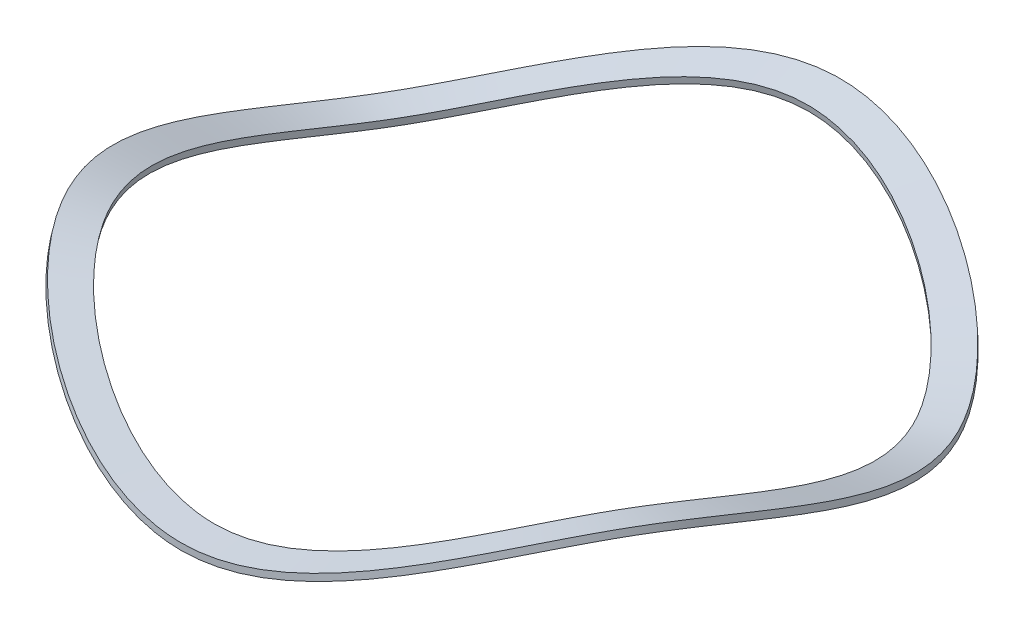
ISO-10303-21;
HEADER;
FILE_DESCRIPTION(('STEP AP214'),'2;1');
FILE_NAME('part.step','',(''),(''),'','','');
FILE_SCHEMA(('AUTOMOTIVE_DESIGN { 1 0 10303 214 1 1 1 1 }'));
ENDSEC;
DATA;
#1=APPLICATION_CONTEXT('core data for automotive mechanical design processes');
#2=APPLICATION_PROTOCOL_DEFINITION('international standard','automotive_design',2000,#1);
#3=PRODUCT_CONTEXT('',#1,'mechanical');
#4=PRODUCT('Part','Part','',(#3));
#5=PRODUCT_RELATED_PRODUCT_CATEGORY('part','',(#4));
#6=PRODUCT_DEFINITION_FORMATION('','',#4);
#7=PRODUCT_DEFINITION_CONTEXT('part definition',#1,'design');
#8=PRODUCT_DEFINITION('design','',#6,#7);
#9=PRODUCT_DEFINITION_SHAPE('','',#8);
#10=(LENGTH_UNIT() NAMED_UNIT(*) SI_UNIT(.MILLI.,.METRE.));
#11=(NAMED_UNIT(*) PLANE_ANGLE_UNIT() SI_UNIT($,.RADIAN.));
#12=(NAMED_UNIT(*) SI_UNIT($,.STERADIAN.) SOLID_ANGLE_UNIT());
#13=UNCERTAINTY_MEASURE_WITH_UNIT(LENGTH_MEASURE(1.E-05),#10,'distance_accuracy_value','');
#14=(GEOMETRIC_REPRESENTATION_CONTEXT(3) GLOBAL_UNCERTAINTY_ASSIGNED_CONTEXT((#13)) GLOBAL_UNIT_ASSIGNED_CONTEXT((#10,
#11,#12)) REPRESENTATION_CONTEXT('',''));
#15=CARTESIAN_POINT('',(0.,0.,0.));
#16=DIRECTION('',(0.,0.,1.));
#17=DIRECTION('',(1.,0.,0.));
#18=AXIS2_PLACEMENT_3D('',#15,#16,#17);
#19=CARTESIAN_POINT('',(0.,0.,50.));
#20=CARTESIAN_POINT('',(3.27154351431869,0.,50.));
#21=CARTESIAN_POINT('',(9.81463054295608,0.782702856647862,49.2882397162853));
#22=CARTESIAN_POINT('',(19.0975008115352,3.38770992085039,46.3508592418559));
#23=CARTESIAN_POINT('',(27.6704119648793,6.55080703150661,41.7493846863027));
#24=CARTESIAN_POINT('',(35.291598474836,9.45009416736736,35.6155367315555));
#25=CARTESIAN_POINT('',(40.2835668557036,10.8427070721693,29.6996978305193));
#26=CARTESIAN_POINT('',(43.8303700733728,11.1004022422383,24.0271337612607));
#27=CARTESIAN_POINT('',(46.7652272701126,10.5760329241454,17.9848707582708));
#28=CARTESIAN_POINT('',(49.1910504978211,8.56427069243838,9.55790119185278));
#29=CARTESIAN_POINT('',(50.0904045163231,5.48583683355643,-0.160659217913017));
#30=CARTESIAN_POINT('',(49.1907709544919,2.41804057128845,-9.84404482748729));
#31=CARTESIAN_POINT('',(46.7836107628812,0.432890377781105,-18.1803151037488));
#32=CARTESIAN_POINT('',(43.9111165307391,-0.0826369161392081,-24.0961567172201));
#33=CARTESIAN_POINT('',(40.4342546300705,0.172408592046726,-29.6532710739928));
#34=CARTESIAN_POINT('',(35.518996620466,1.54030422594464,-35.4872711204258));
#35=CARTESIAN_POINT('',(27.9442822467468,4.42209673444902,-41.5894228535622));
#36=CARTESIAN_POINT('',(19.3623990549779,7.58878977101956,-46.1996071362876));
#37=CARTESIAN_POINT('',(10.0085012142454,10.2179370467378,-49.1662614613891));
#38=CARTESIAN_POINT('',(0.,11.4177494644719,-50.259834078264));
#39=CARTESIAN_POINT('',(-10.0085012142454,10.2179370467378,-49.1662614613891));
#40=CARTESIAN_POINT('',(-19.3623990549779,7.58878977101956,-46.1996071362876));
#41=CARTESIAN_POINT('',(-27.9442822467468,4.42209673444902,-41.5894228535622));
#42=CARTESIAN_POINT('',(-35.518996620466,1.54030422594464,-35.4872711204258));
#43=CARTESIAN_POINT('',(-40.4342546300705,0.17240859204672,-29.6532710739928));
#44=CARTESIAN_POINT('',(-43.9111165307391,-0.082636916139211,-24.0961567172201));
#45=CARTESIAN_POINT('',(-46.7836107628812,0.432890377781105,-18.1803151037488));
#46=CARTESIAN_POINT('',(-49.1907709544919,2.41804057128844,-9.84404482748729));
#47=CARTESIAN_POINT('',(-50.0904045163231,5.48583683355641,-0.160659217913018));
#48=CARTESIAN_POINT('',(-49.1910504978212,8.56427069243839,9.5579011918528));
#49=CARTESIAN_POINT('',(-46.7652272701126,10.5760329241454,17.9848707582708));
#50=CARTESIAN_POINT('',(-43.8303700733728,11.1004022422383,24.0271337612607));
#51=CARTESIAN_POINT('',(-40.2835668557036,10.8427070721693,29.6996978305193));
#52=CARTESIAN_POINT('',(-35.291598474836,9.45009416736736,35.6155367315556));
#53=CARTESIAN_POINT('',(-27.6704119648793,6.55080703150661,41.7493846863027));
#54=CARTESIAN_POINT('',(-19.0975008115352,3.38770992085038,46.350859241856));
#55=CARTESIAN_POINT('',(-9.81463054295608,0.782702856647856,49.2882397162853));
#56=CARTESIAN_POINT('',(-3.2715435143187,0.,50.));
#57=CARTESIAN_POINT('',(0.,0.,50.));
#58=CARTESIAN_POINT('',(0.,0.,45.));
#59=CARTESIAN_POINT('',(2.92283573777247,0.,45.));
#60=CARTESIAN_POINT('',(8.76850721331743,0.703124999999999,44.3671875));
#61=CARTESIAN_POINT('',(17.2287465949167,3.076171875,41.697509765625));
#62=CARTESIAN_POINT('',(25.0724503130795,5.9765625,37.4853515625));
#63=CARTESIAN_POINT('',(31.9913505360861,8.61328124999935,31.9086914062514));
#64=CARTESIAN_POINT('',(36.4136618997475,9.84374999999966,26.6484375000017));
#65=CARTESIAN_POINT('',(39.5191748711311,10.0781250000002,21.6914062500019));
#66=CARTESIAN_POINT('',(42.076656141683,9.60937500000001,16.41796875));
#67=CARTESIAN_POINT('',(44.2687829450124,7.81250000000001,8.85937499999999));
#68=CARTESIAN_POINT('',(45.0908304962609,5.,0.));
#69=CARTESIAN_POINT('',(44.2687829450124,2.1875,-8.859375));
#70=CARTESIAN_POINT('',(42.076656141683,0.390625,-16.41796875));
#71=CARTESIAN_POINT('',(39.5191748711311,-0.0781250000001743,-21.691406250002));
#72=CARTESIAN_POINT('',(36.4136618997475,0.156250000000348,-26.6484375000017));
#73=CARTESIAN_POINT('',(31.9913505360862,1.38671875000065,-31.9086914062514));
#74=CARTESIAN_POINT('',(25.0724503130796,4.0234375,-37.4853515625));
#75=CARTESIAN_POINT('',(17.2287465949167,6.923828125,-41.697509765625));
#76=CARTESIAN_POINT('',(8.76850721331744,9.296875,-44.3671875));
#77=CARTESIAN_POINT('',(0.,10.3515625,-45.31640625));
#78=CARTESIAN_POINT('',(-8.76850721331743,9.296875,-44.3671875));
#79=CARTESIAN_POINT('',(-17.2287465949167,6.923828125,-41.697509765625));
#80=CARTESIAN_POINT('',(-25.0724503130795,4.0234375,-37.4853515625));
#81=CARTESIAN_POINT('',(-31.9913505360861,1.38671875000065,-31.9086914062514));
#82=CARTESIAN_POINT('',(-36.4136618997475,0.156250000000345,-26.6484375000017));
#83=CARTESIAN_POINT('',(-39.5191748711311,-0.0781250000001755,-21.691406250002));
#84=CARTESIAN_POINT('',(-42.076656141683,0.390625,-16.41796875));
#85=CARTESIAN_POINT('',(-44.2687829450124,2.1875,-8.85937500000002));
#86=CARTESIAN_POINT('',(-45.0908304962609,5.,0.));
#87=CARTESIAN_POINT('',(-44.2687829450124,7.81250000000001,8.859375));
#88=CARTESIAN_POINT('',(-42.076656141683,9.60937500000001,16.41796875));
#89=CARTESIAN_POINT('',(-39.5191748711311,10.0781250000002,21.691406250002));
#90=CARTESIAN_POINT('',(-36.4136618997475,9.84374999999966,26.6484375000018));
#91=CARTESIAN_POINT('',(-31.9913505360862,8.61328124999935,31.9086914062514));
#92=CARTESIAN_POINT('',(-25.0724503130796,5.9765625,37.4853515625));
#93=CARTESIAN_POINT('',(-17.2287465949167,3.076171875,41.697509765625));
#94=CARTESIAN_POINT('',(-8.76850721331744,0.703124999999999,44.3671875));
#95=CARTESIAN_POINT('',(-2.92283573777248,0.,45.));
#96=CARTESIAN_POINT('',(0.,0.,45.));
#97=B_SPLINE_SURFACE_WITH_KNOTS('',1,3,((#19,#20,#21,#22,#23,#24,#25,#26,#27,#28,#29,#30,#31,
#32,#33,#34,#35,#36,#37,#38,#39,#40,#41,#42,#43,#44,#45,#46,#47,#48,#49,#50,#51,#52,#53,#54,#55,
#56,#57),(#58,#59,#60,#61,#62,#63,#64,#65,#66,#67,#68,#69,#70,#71,#72,#73,#74,#75,#76,#77,#78,
#79,#80,#81,#82,#83,#84,#85,#86,#87,#88,#89,#90,#91,#92,#93,#94,#95,#96)),.UNSPECIFIED.,.F.,.T.,
.F.,(2,2),(4,1,1,1,1,1,1,1,1,1,1,1,1,1,1,1,1,1,1,1,1,1,1,1,1,1,1,1,1,1,1,1,1,1,1,1,4),
(0.583333333333333,1.),(0.,0.03125,0.0625,0.09375,0.125,0.156249999999977,0.166666666666667,
0.1875,0.21875,0.25,0.28125,0.3125,0.333333333333333,0.343750000000023,0.375,0.40625,0.4375,
0.46875,0.5,0.53125,0.5625,0.59375,0.625,0.656249999999977,0.666666666666667,0.6875,0.71875,
0.75,0.78125,0.8125,0.833333333333333,0.843750000000023,0.875,0.90625,0.9375,0.96875,1.),.UNSPECIFIED.);
#98=CARTESIAN_POINT('',(0.,0.,45.));
#99=CARTESIAN_POINT('',(2.92283573777247,0.,45.));
#100=CARTESIAN_POINT('',(8.76850721331743,0.703124999999999,44.3671875));
#101=CARTESIAN_POINT('',(17.2287465949167,3.076171875,41.697509765625));
#102=CARTESIAN_POINT('',(25.0724503130795,5.9765625,37.4853515625));
#103=CARTESIAN_POINT('',(31.9913505360861,8.61328124999935,31.9086914062514));
#104=CARTESIAN_POINT('',(36.4136618997475,9.84374999999966,26.6484375000017));
#105=CARTESIAN_POINT('',(39.5191748711311,10.0781250000002,21.6914062500019));
#106=CARTESIAN_POINT('',(42.076656141683,9.60937500000001,16.41796875));
#107=CARTESIAN_POINT('',(44.2687829450124,7.81250000000001,8.85937499999999));
#108=CARTESIAN_POINT('',(45.0908304962609,5.,0.));
#109=CARTESIAN_POINT('',(44.2687829450124,2.1875,-8.859375));
#110=CARTESIAN_POINT('',(42.076656141683,0.390625,-16.41796875));
#111=CARTESIAN_POINT('',(39.5191748711311,-0.0781250000001743,-21.691406250002));
#112=CARTESIAN_POINT('',(36.4136618997475,0.156250000000348,-26.6484375000017));
#113=CARTESIAN_POINT('',(31.9913505360862,1.38671875000065,-31.9086914062514));
#114=CARTESIAN_POINT('',(25.0724503130796,4.0234375,-37.4853515625));
#115=CARTESIAN_POINT('',(17.2287465949167,6.923828125,-41.697509765625));
#116=CARTESIAN_POINT('',(8.76850721331744,9.296875,-44.3671875));
#117=CARTESIAN_POINT('',(0.,10.3515625,-45.31640625));
#118=CARTESIAN_POINT('',(-8.76850721331743,9.296875,-44.3671875));
#119=CARTESIAN_POINT('',(-17.2287465949167,6.923828125,-41.697509765625));
#120=CARTESIAN_POINT('',(-25.0724503130795,4.0234375,-37.4853515625));
#121=CARTESIAN_POINT('',(-31.9913505360861,1.38671875000065,-31.9086914062514));
#122=CARTESIAN_POINT('',(-36.4136618997475,0.156250000000345,-26.6484375000017));
#123=CARTESIAN_POINT('',(-39.5191748711311,-0.0781250000001755,-21.691406250002));
#124=CARTESIAN_POINT('',(-42.076656141683,0.390625,-16.41796875));
#125=CARTESIAN_POINT('',(-44.2687829450124,2.1875,-8.85937500000002));
#126=CARTESIAN_POINT('',(-45.0908304962609,5.,0.));
#127=CARTESIAN_POINT('',(-44.2687829450124,7.81250000000001,8.859375));
#128=CARTESIAN_POINT('',(-42.076656141683,9.60937500000001,16.41796875));
#129=CARTESIAN_POINT('',(-39.5191748711311,10.0781250000002,21.691406250002));
#130=CARTESIAN_POINT('',(-36.4136618997475,9.84374999999966,26.6484375000018));
#131=CARTESIAN_POINT('',(-31.9913505360862,8.61328124999935,31.9086914062514));
#132=CARTESIAN_POINT('',(-25.0724503130796,5.9765625,37.4853515625));
#133=CARTESIAN_POINT('',(-17.2287465949167,3.076171875,41.697509765625));
#134=CARTESIAN_POINT('',(-8.76850721331744,0.703124999999999,44.3671875));
#135=CARTESIAN_POINT('',(-2.92283573777248,0.,45.));
#136=CARTESIAN_POINT('',(0.,0.,45.));
#137=B_SPLINE_CURVE_WITH_KNOTS('',3,(#98,#99,#100,#101,#102,#103,#104,#105,#106,#107,#108,#109,
#110,#111,#112,#113,#114,#115,#116,#117,#118,#119,#120,#121,#122,#123,#124,#125,#126,#127,#128,
#129,#130,#131,#132,#133,#134,#135,#136),.UNSPECIFIED.,.T.,.F.,(4,1,1,1,1,1,1,1,1,1,1,1,1,1,1,1,
1,1,1,1,1,1,1,1,1,1,1,1,1,1,1,1,1,1,1,1,4),(0.,0.03125,0.0625,0.09375,0.125,0.156249999999977,
0.166666666666667,0.1875,0.21875,0.25,0.28125,0.3125,0.333333333333333,0.343750000000023,0.375,
0.40625,0.4375,0.46875,0.5,0.53125,0.5625,0.59375,0.625,0.656249999999977,0.666666666666667,
0.6875,0.71875,0.75,0.78125,0.8125,0.833333333333333,0.843750000000023,0.875,0.90625,0.9375,
0.96875,1.),.UNSPECIFIED.);
#138=CARTESIAN_POINT('',(0.,0.,45.));
#139=VERTEX_POINT('',#138);
#140=EDGE_CURVE('E68',#139,#139,#137,.T.);
#141=CARTESIAN_POINT('',(0.,0.,50.));
#142=CARTESIAN_POINT('',(3.27154351431869,0.,50.));
#143=CARTESIAN_POINT('',(9.81463054295608,0.782702856647862,49.2882397162853));
#144=CARTESIAN_POINT('',(19.0975008115352,3.38770992085039,46.3508592418559));
#145=CARTESIAN_POINT('',(27.6704119648793,6.55080703150661,41.7493846863027));
#146=CARTESIAN_POINT('',(35.291598474836,9.45009416736736,35.6155367315555));
#147=CARTESIAN_POINT('',(40.2835668557036,10.8427070721693,29.6996978305193));
#148=CARTESIAN_POINT('',(43.8303700733728,11.1004022422383,24.0271337612607));
#149=CARTESIAN_POINT('',(46.7652272701126,10.5760329241454,17.9848707582708));
#150=CARTESIAN_POINT('',(49.1910504978211,8.56427069243838,9.55790119185278));
#151=CARTESIAN_POINT('',(50.0904045163231,5.48583683355643,-0.160659217913017));
#152=CARTESIAN_POINT('',(49.1907709544919,2.41804057128845,-9.84404482748729));
#153=CARTESIAN_POINT('',(46.7836107628812,0.432890377781105,-18.1803151037488));
#154=CARTESIAN_POINT('',(43.9111165307391,-0.0826369161392081,-24.0961567172201));
#155=CARTESIAN_POINT('',(40.4342546300705,0.172408592046726,-29.6532710739928));
#156=CARTESIAN_POINT('',(35.518996620466,1.54030422594464,-35.4872711204258));
#157=CARTESIAN_POINT('',(27.9442822467468,4.42209673444902,-41.5894228535622));
#158=CARTESIAN_POINT('',(19.3623990549779,7.58878977101956,-46.1996071362876));
#159=CARTESIAN_POINT('',(10.0085012142454,10.2179370467378,-49.1662614613891));
#160=CARTESIAN_POINT('',(0.,11.4177494644719,-50.259834078264));
#161=CARTESIAN_POINT('',(-10.0085012142454,10.2179370467378,-49.1662614613891));
#162=CARTESIAN_POINT('',(-19.3623990549779,7.58878977101956,-46.1996071362876));
#163=CARTESIAN_POINT('',(-27.9442822467468,4.42209673444902,-41.5894228535622));
#164=CARTESIAN_POINT('',(-35.518996620466,1.54030422594464,-35.4872711204258));
#165=CARTESIAN_POINT('',(-40.4342546300705,0.17240859204672,-29.6532710739928));
#166=CARTESIAN_POINT('',(-43.9111165307391,-0.082636916139211,-24.0961567172201));
#167=CARTESIAN_POINT('',(-46.7836107628812,0.432890377781105,-18.1803151037488));
#168=CARTESIAN_POINT('',(-49.1907709544919,2.41804057128844,-9.84404482748729));
#169=CARTESIAN_POINT('',(-50.0904045163231,5.48583683355641,-0.160659217913018));
#170=CARTESIAN_POINT('',(-49.1910504978212,8.56427069243839,9.5579011918528));
#171=CARTESIAN_POINT('',(-46.7652272701126,10.5760329241454,17.9848707582708));
#172=CARTESIAN_POINT('',(-43.8303700733728,11.1004022422383,24.0271337612607));
#173=CARTESIAN_POINT('',(-40.2835668557036,10.8427070721693,29.6996978305193));
#174=CARTESIAN_POINT('',(-35.291598474836,9.45009416736736,35.6155367315556));
#175=CARTESIAN_POINT('',(-27.6704119648793,6.55080703150661,41.7493846863027));
#176=CARTESIAN_POINT('',(-19.0975008115352,3.38770992085038,46.350859241856));
#177=CARTESIAN_POINT('',(-9.81463054295608,0.782702856647856,49.2882397162853));
#178=CARTESIAN_POINT('',(-3.2715435143187,0.,50.));
#179=CARTESIAN_POINT('',(0.,0.,50.));
#180=B_SPLINE_CURVE_WITH_KNOTS('',3,(#141,#142,#143,#144,#145,#146,#147,#148,#149,#150,#151,
#152,#153,#154,#155,#156,#157,#158,#159,#160,#161,#162,#163,#164,#165,#166,#167,#168,#169,#170,
#171,#172,#173,#174,#175,#176,#177,#178,#179),.UNSPECIFIED.,.T.,.F.,(4,1,1,1,1,1,1,1,1,1,1,1,1,
1,1,1,1,1,1,1,1,1,1,1,1,1,1,1,1,1,1,1,1,1,1,1,4),(0.,0.03125,0.0625,0.09375,0.125,
0.156249999999977,0.166666666666667,0.1875,0.21875,0.25,0.28125,0.3125,0.333333333333333,
0.343750000000023,0.375,0.40625,0.4375,0.46875,0.5,0.53125,0.5625,0.59375,0.625,
0.656249999999977,0.666666666666667,0.6875,0.71875,0.75,0.78125,0.8125,0.833333333333333,
0.843750000000023,0.875,0.90625,0.9375,0.96875,1.),.UNSPECIFIED.);
#181=CARTESIAN_POINT('',(0.,0.,50.));
#182=VERTEX_POINT('',#181);
#183=EDGE_CURVE('E64',#182,#182,#180,.T.);
#184=ORIENTED_EDGE('',*,*,#140,.T.);
#185=EDGE_LOOP('',(#184));
#186=FACE_BOUND('',#185,.T.);
#187=ORIENTED_EDGE('',*,*,#183,.F.);
#188=EDGE_LOOP('',(#187));
#189=FACE_BOUND('',#188,.T.);
#190=ADVANCED_FACE('F49',(#186,#189),#97,.T.);
#191=CARTESIAN_POINT('',(0.,0.999999999999999,50.));
#192=CARTESIAN_POINT('',(3.2008774090095,1.,50.));
#193=CARTESIAN_POINT('',(9.60263222702851,1.76419424027489,49.306849379359));
#194=CARTESIAN_POINT('',(18.7987950886189,4.3407117601444,46.4037375299214));
#195=CARTESIAN_POINT('',(27.3478902499427,7.49487158073612,41.8188291408217));
#196=CARTESIAN_POINT('',(35.0002884653279,10.4059457302109,35.6653019039945));
#197=CARTESIAN_POINT('',(40.0559060060034,11.819507781447,29.6825427860363));
#198=CARTESIAN_POINT('',(43.6623484999502,12.0793265102728,23.9112690642189));
#199=CARTESIAN_POINT('',(46.6507140639289,11.5474140844795,17.7606130550235));
#200=CARTESIAN_POINT('',(49.0900662090812,9.51392610769907,9.26239534477307));
#201=CARTESIAN_POINT('',(49.9875552582913,6.43051149918637,-0.473049474228799));
#202=CARTESIAN_POINT('',(49.0892431139196,3.37841852631132,-10.1049246322249));
#203=CARTESIAN_POINT('',(46.7048429318624,1.4232877757271,-18.3360848273275));
#204=CARTESIAN_POINT('',(43.900100617128,0.917410052083416,-24.1145021774537));
#205=CARTESIAN_POINT('',(40.4995952842342,1.16942704268995,-29.5458425515258));
#206=CARTESIAN_POINT('',(35.6698458964434,2.51021087330849,-35.2876330674673));
#207=CARTESIAN_POINT('',(28.1542815328534,5.36977335491723,-41.3478330669113));
#208=CARTESIAN_POINT('',(19.578768851796,8.53452111988729,-45.9583866191893));
#209=CARTESIAN_POINT('',(10.1734704292378,11.1821177506451,-48.947693209576));
#210=CARTESIAN_POINT('',(0.,12.40425207431,-50.0637746066024));
#211=CARTESIAN_POINT('',(-10.1734704292378,11.1821177506451,-48.947693209576));
#212=CARTESIAN_POINT('',(-19.578768851796,8.53452111988729,-45.9583866191893));
#213=CARTESIAN_POINT('',(-28.1542815328534,5.36977335491723,-41.3478330669113));
#214=CARTESIAN_POINT('',(-35.6698458964434,2.51021087330849,-35.2876330674673));
#215=CARTESIAN_POINT('',(-40.4995952842342,1.16942704268994,-29.5458425515258));
#216=CARTESIAN_POINT('',(-43.900100617128,0.917410052083413,-24.1145021774537));
#217=CARTESIAN_POINT('',(-46.7048429318624,1.4232877757271,-18.3360848273275));
#218=CARTESIAN_POINT('',(-49.0892431139196,3.37841852631131,-10.1049246322249));
#219=CARTESIAN_POINT('',(-49.9875552582913,6.43051149918636,-0.4730494742288));
#220=CARTESIAN_POINT('',(-49.0900662090812,9.51392610769907,9.26239534477309));
#221=CARTESIAN_POINT('',(-46.6507140639289,11.5474140844795,17.7606130550236));
#222=CARTESIAN_POINT('',(-43.6623484999502,12.0793265102728,23.9112690642189));
#223=CARTESIAN_POINT('',(-40.0559060060034,11.8195077814469,29.6825427860364));
#224=CARTESIAN_POINT('',(-35.0002884653279,10.4059457302109,35.6653019039946));
#225=CARTESIAN_POINT('',(-27.3478902499427,7.49487158073612,41.8188291408217));
#226=CARTESIAN_POINT('',(-18.7987950886189,4.34071176014439,46.4037375299215));
#227=CARTESIAN_POINT('',(-9.60263222702851,1.76419424027488,49.306849379359));
#228=CARTESIAN_POINT('',(-3.20087740900951,0.999999999999999,50.));
#229=CARTESIAN_POINT('',(0.,0.999999999999999,50.));
#230=CARTESIAN_POINT('',(0.,0.,50.));
#231=CARTESIAN_POINT('',(3.27154351431869,0.,50.));
#232=CARTESIAN_POINT('',(9.81463054295608,0.782702856647862,49.2882397162853));
#233=CARTESIAN_POINT('',(19.0975008115352,3.38770992085039,46.3508592418559));
#234=CARTESIAN_POINT('',(27.6704119648793,6.55080703150661,41.7493846863027));
#235=CARTESIAN_POINT('',(35.291598474836,9.45009416736736,35.6155367315555));
#236=CARTESIAN_POINT('',(40.2835668557036,10.8427070721693,29.6996978305193));
#237=CARTESIAN_POINT('',(43.8303700733728,11.1004022422383,24.0271337612607));
#238=CARTESIAN_POINT('',(46.7652272701126,10.5760329241454,17.9848707582708));
#239=CARTESIAN_POINT('',(49.1910504978211,8.56427069243838,9.55790119185278));
#240=CARTESIAN_POINT('',(50.0904045163231,5.48583683355643,-0.160659217913017));
#241=CARTESIAN_POINT('',(49.1907709544919,2.41804057128845,-9.84404482748729));
#242=CARTESIAN_POINT('',(46.7836107628812,0.432890377781105,-18.1803151037488));
#243=CARTESIAN_POINT('',(43.9111165307391,-0.0826369161392081,-24.0961567172201));
#244=CARTESIAN_POINT('',(40.4342546300705,0.172408592046726,-29.6532710739928));
#245=CARTESIAN_POINT('',(35.518996620466,1.54030422594464,-35.4872711204258));
#246=CARTESIAN_POINT('',(27.9442822467468,4.42209673444902,-41.5894228535622));
#247=CARTESIAN_POINT('',(19.3623990549779,7.58878977101956,-46.1996071362876));
#248=CARTESIAN_POINT('',(10.0085012142454,10.2179370467378,-49.1662614613891));
#249=CARTESIAN_POINT('',(0.,11.4177494644719,-50.259834078264));
#250=CARTESIAN_POINT('',(-10.0085012142454,10.2179370467378,-49.1662614613891));
#251=CARTESIAN_POINT('',(-19.3623990549779,7.58878977101956,-46.1996071362876));
#252=CARTESIAN_POINT('',(-27.9442822467468,4.42209673444902,-41.5894228535622));
#253=CARTESIAN_POINT('',(-35.518996620466,1.54030422594464,-35.4872711204258));
#254=CARTESIAN_POINT('',(-40.4342546300705,0.17240859204672,-29.6532710739928));
#255=CARTESIAN_POINT('',(-43.9111165307391,-0.082636916139211,-24.0961567172201));
#256=CARTESIAN_POINT('',(-46.7836107628812,0.432890377781105,-18.1803151037488));
#257=CARTESIAN_POINT('',(-49.1907709544919,2.41804057128844,-9.84404482748729));
#258=CARTESIAN_POINT('',(-50.0904045163231,5.48583683355641,-0.160659217913018));
#259=CARTESIAN_POINT('',(-49.1910504978212,8.56427069243839,9.5579011918528));
#260=CARTESIAN_POINT('',(-46.7652272701126,10.5760329241454,17.9848707582708));
#261=CARTESIAN_POINT('',(-43.8303700733728,11.1004022422383,24.0271337612607));
#262=CARTESIAN_POINT('',(-40.2835668557036,10.8427070721693,29.6996978305193));
#263=CARTESIAN_POINT('',(-35.291598474836,9.45009416736736,35.6155367315556));
#264=CARTESIAN_POINT('',(-27.6704119648793,6.55080703150661,41.7493846863027));
#265=CARTESIAN_POINT('',(-19.0975008115352,3.38770992085038,46.350859241856));
#266=CARTESIAN_POINT('',(-9.81463054295608,0.782702856647856,49.2882397162853));
#267=CARTESIAN_POINT('',(-3.2715435143187,0.,50.));
#268=CARTESIAN_POINT('',(0.,0.,50.));
#269=B_SPLINE_SURFACE_WITH_KNOTS('',1,3,((#191,#192,#193,#194,#195,#196,#197,#198,#199,#200,
#201,#202,#203,#204,#205,#206,#207,#208,#209,#210,#211,#212,#213,#214,#215,#216,#217,#218,#219,
#220,#221,#222,#223,#224,#225,#226,#227,#228,#229),(#230,#231,#232,#233,#234,#235,#236,#237,
#238,#239,#240,#241,#242,#243,#244,#245,#246,#247,#248,#249,#250,#251,#252,#253,#254,#255,#256,
#257,#258,#259,#260,#261,#262,#263,#264,#265,#266,#267,#268)),.UNSPECIFIED.,.F.,.T.,.F.,(2,2),
(4,1,1,1,1,1,1,1,1,1,1,1,1,1,1,1,1,1,1,1,1,1,1,1,1,1,1,1,1,1,1,1,1,1,1,1,4),(0.5,
0.583333333333333),(0.,0.03125,0.0625,0.09375,0.125,0.156249999999977,0.166666666666667,0.1875,
0.21875,0.25,0.28125,0.3125,0.333333333333333,0.343750000000023,0.375,0.40625,0.4375,0.46875,
0.5,0.53125,0.5625,0.59375,0.625,0.656249999999977,0.666666666666667,0.6875,0.71875,0.75,
0.78125,0.8125,0.833333333333333,0.843750000000023,0.875,0.90625,0.9375,0.96875,1.),.UNSPECIFIED.);
#270=CARTESIAN_POINT('',(0.,0.999999999999999,50.));
#271=CARTESIAN_POINT('',(3.2008774090095,1.,50.));
#272=CARTESIAN_POINT('',(9.60263222702851,1.76419424027489,49.306849379359));
#273=CARTESIAN_POINT('',(18.7987950886189,4.3407117601444,46.4037375299214));
#274=CARTESIAN_POINT('',(27.3478902499427,7.49487158073612,41.8188291408217));
#275=CARTESIAN_POINT('',(35.0002884653279,10.4059457302109,35.6653019039945));
#276=CARTESIAN_POINT('',(40.0559060060034,11.819507781447,29.6825427860363));
#277=CARTESIAN_POINT('',(43.6623484999502,12.0793265102728,23.9112690642189));
#278=CARTESIAN_POINT('',(46.6507140639289,11.5474140844795,17.7606130550235));
#279=CARTESIAN_POINT('',(49.0900662090812,9.51392610769907,9.26239534477307));
#280=CARTESIAN_POINT('',(49.9875552582913,6.43051149918637,-0.473049474228799));
#281=CARTESIAN_POINT('',(49.0892431139196,3.37841852631132,-10.1049246322249));
#282=CARTESIAN_POINT('',(46.7048429318624,1.4232877757271,-18.3360848273275));
#283=CARTESIAN_POINT('',(43.900100617128,0.917410052083416,-24.1145021774537));
#284=CARTESIAN_POINT('',(40.4995952842342,1.16942704268995,-29.5458425515258));
#285=CARTESIAN_POINT('',(35.6698458964434,2.51021087330849,-35.2876330674673));
#286=CARTESIAN_POINT('',(28.1542815328534,5.36977335491723,-41.3478330669113));
#287=CARTESIAN_POINT('',(19.578768851796,8.53452111988729,-45.9583866191893));
#288=CARTESIAN_POINT('',(10.1734704292378,11.1821177506451,-48.947693209576));
#289=CARTESIAN_POINT('',(0.,12.40425207431,-50.0637746066024));
#290=CARTESIAN_POINT('',(-10.1734704292378,11.1821177506451,-48.947693209576));
#291=CARTESIAN_POINT('',(-19.578768851796,8.53452111988729,-45.9583866191893));
#292=CARTESIAN_POINT('',(-28.1542815328534,5.36977335491723,-41.3478330669113));
#293=CARTESIAN_POINT('',(-35.6698458964434,2.51021087330849,-35.2876330674673));
#294=CARTESIAN_POINT('',(-40.4995952842342,1.16942704268994,-29.5458425515258));
#295=CARTESIAN_POINT('',(-43.900100617128,0.917410052083413,-24.1145021774537));
#296=CARTESIAN_POINT('',(-46.7048429318624,1.4232877757271,-18.3360848273275));
#297=CARTESIAN_POINT('',(-49.0892431139196,3.37841852631131,-10.1049246322249));
#298=CARTESIAN_POINT('',(-49.9875552582913,6.43051149918636,-0.4730494742288));
#299=CARTESIAN_POINT('',(-49.0900662090812,9.51392610769907,9.26239534477309));
#300=CARTESIAN_POINT('',(-46.6507140639289,11.5474140844795,17.7606130550236));
#301=CARTESIAN_POINT('',(-43.6623484999502,12.0793265102728,23.9112690642189));
#302=CARTESIAN_POINT('',(-40.0559060060034,11.8195077814469,29.6825427860364));
#303=CARTESIAN_POINT('',(-35.0002884653279,10.4059457302109,35.6653019039946));
#304=CARTESIAN_POINT('',(-27.3478902499427,7.49487158073612,41.8188291408217));
#305=CARTESIAN_POINT('',(-18.7987950886189,4.34071176014439,46.4037375299215));
#306=CARTESIAN_POINT('',(-9.60263222702851,1.76419424027488,49.306849379359));
#307=CARTESIAN_POINT('',(-3.20087740900951,0.999999999999999,50.));
#308=CARTESIAN_POINT('',(0.,0.999999999999999,50.));
#309=B_SPLINE_CURVE_WITH_KNOTS('',3,(#270,#271,#272,#273,#274,#275,#276,#277,#278,#279,#280,
#281,#282,#283,#284,#285,#286,#287,#288,#289,#290,#291,#292,#293,#294,#295,#296,#297,#298,#299,
#300,#301,#302,#303,#304,#305,#306,#307,#308),.UNSPECIFIED.,.T.,.F.,(4,1,1,1,1,1,1,1,1,1,1,1,1,
1,1,1,1,1,1,1,1,1,1,1,1,1,1,1,1,1,1,1,1,1,1,1,4),(0.,0.03125,0.0625,0.09375,0.125,
0.156249999999977,0.166666666666667,0.1875,0.21875,0.25,0.28125,0.3125,0.333333333333333,
0.343750000000023,0.375,0.40625,0.4375,0.46875,0.5,0.53125,0.5625,0.59375,0.625,
0.656249999999977,0.666666666666667,0.6875,0.71875,0.75,0.78125,0.8125,0.833333333333333,
0.843750000000023,0.875,0.90625,0.9375,0.96875,1.),.UNSPECIFIED.);
#310=CARTESIAN_POINT('',(0.,0.999999999999999,50.));
#311=VERTEX_POINT('',#310);
#312=EDGE_CURVE('E60',#311,#311,#309,.T.);
#313=ORIENTED_EDGE('',*,*,#183,.T.);
#314=EDGE_LOOP('',(#313));
#315=FACE_BOUND('',#314,.T.);
#316=ORIENTED_EDGE('',*,*,#312,.F.);
#317=EDGE_LOOP('',(#316));
#318=FACE_BOUND('',#317,.T.);
#319=ADVANCED_FACE('F96',(#315,#318),#269,.T.);
#320=CARTESIAN_POINT('',(0.,1.,45.));
#321=CARTESIAN_POINT('',(2.85216963246328,0.999999999999999,45.));
#322=CARTESIAN_POINT('',(8.55650889738986,1.68461638362702,44.3857971630737));
#323=CARTESIAN_POINT('',(16.9300408720004,4.02917371429401,41.7503880536905));
#324=CARTESIAN_POINT('',(24.749928598143,6.9206270492295,37.554796017019));
#325=CARTESIAN_POINT('',(31.7000405265781,9.56913281284291,31.9584565786904));
#326=CARTESIAN_POINT('',(36.1860010500472,10.8205507092773,26.6312824555188));
#327=CARTESIAN_POINT('',(39.3511532977085,11.0570492680347,21.5755415529602));
#328=CARTESIAN_POINT('',(41.9621429354994,10.5807561603341,16.1937110467527));
#329=CARTESIAN_POINT('',(44.1677986562724,8.76215541526069,8.56386915292027));
#330=CARTESIAN_POINT('',(44.987981238229,5.94467466562995,-0.312390256315791));
#331=CARTESIAN_POINT('',(44.1672551044401,3.14787795502288,-9.12025480473759));
#332=CARTESIAN_POINT('',(41.9978883106642,1.38102239794599,-16.5737384735787));
#333=CARTESIAN_POINT('',(39.5081589575201,0.921921968222449,-21.7097517102355));
#334=CARTESIAN_POINT('',(36.4790025539112,1.15326845064357,-26.5410089775347));
#335=CARTESIAN_POINT('',(32.1421998120636,2.3566253973645,-31.7090533532929));
#336=CARTESIAN_POINT('',(25.2824495991862,4.97111412046821,-37.2437617758491));
#337=CARTESIAN_POINT('',(17.4451163917348,7.86955947386773,-41.4562892485267));
#338=CARTESIAN_POINT('',(8.93347642830981,10.2610557039073,-44.1486192481869));
#339=CARTESIAN_POINT('',(0.,11.338065109838,-45.1203467783384));
#340=CARTESIAN_POINT('',(-8.9334764283098,10.2610557039073,-44.1486192481869));
#341=CARTESIAN_POINT('',(-17.4451163917348,7.86955947386773,-41.4562892485267));
#342=CARTESIAN_POINT('',(-25.2824495991862,4.97111412046821,-37.2437617758491));
#343=CARTESIAN_POINT('',(-32.1421998120635,2.3566253973645,-31.7090533532929));
#344=CARTESIAN_POINT('',(-36.4790025539112,1.15326845064356,-26.5410089775347));
#345=CARTESIAN_POINT('',(-39.5081589575201,0.921921968222447,-21.7097517102355));
#346=CARTESIAN_POINT('',(-41.9978883106641,1.38102239794599,-16.5737384735787));
#347=CARTESIAN_POINT('',(-44.1672551044401,3.14787795502287,-9.12025480473761));
#348=CARTESIAN_POINT('',(-44.987981238229,5.94467466562994,-0.312390256315792));
#349=CARTESIAN_POINT('',(-44.1677986562724,8.7621554152607,8.56386915292029));
#350=CARTESIAN_POINT('',(-41.9621429354994,10.5807561603341,16.1937110467528));
#351=CARTESIAN_POINT('',(-39.3511532977085,11.0570492680347,21.5755415529602));
#352=CARTESIAN_POINT('',(-36.1860010500472,10.8205507092773,26.6312824555188));
#353=CARTESIAN_POINT('',(-31.7000405265781,9.56913281284291,31.9584565786904));
#354=CARTESIAN_POINT('',(-24.749928598143,6.9206270492295,37.554796017019));
#355=CARTESIAN_POINT('',(-16.9300408720004,4.02917371429401,41.7503880536905));
#356=CARTESIAN_POINT('',(-8.55650889738987,1.68461638362702,44.3857971630737));
#357=CARTESIAN_POINT('',(-2.85216963246329,1.,45.));
#358=CARTESIAN_POINT('',(0.,1.,45.));
#359=CARTESIAN_POINT('',(0.,0.999999999999999,50.));
#360=CARTESIAN_POINT('',(3.2008774090095,1.,50.));
#361=CARTESIAN_POINT('',(9.60263222702851,1.76419424027489,49.306849379359));
#362=CARTESIAN_POINT('',(18.7987950886189,4.3407117601444,46.4037375299214));
#363=CARTESIAN_POINT('',(27.3478902499427,7.49487158073612,41.8188291408217));
#364=CARTESIAN_POINT('',(35.0002884653279,10.4059457302109,35.6653019039945));
#365=CARTESIAN_POINT('',(40.0559060060034,11.819507781447,29.6825427860363));
#366=CARTESIAN_POINT('',(43.6623484999502,12.0793265102728,23.9112690642189));
#367=CARTESIAN_POINT('',(46.6507140639289,11.5474140844795,17.7606130550235));
#368=CARTESIAN_POINT('',(49.0900662090812,9.51392610769907,9.26239534477307));
#369=CARTESIAN_POINT('',(49.9875552582913,6.43051149918637,-0.473049474228799));
#370=CARTESIAN_POINT('',(49.0892431139196,3.37841852631132,-10.1049246322249));
#371=CARTESIAN_POINT('',(46.7048429318624,1.4232877757271,-18.3360848273275));
#372=CARTESIAN_POINT('',(43.900100617128,0.917410052083416,-24.1145021774537));
#373=CARTESIAN_POINT('',(40.4995952842342,1.16942704268995,-29.5458425515258));
#374=CARTESIAN_POINT('',(35.6698458964434,2.51021087330849,-35.2876330674673));
#375=CARTESIAN_POINT('',(28.1542815328534,5.36977335491723,-41.3478330669113));
#376=CARTESIAN_POINT('',(19.578768851796,8.53452111988729,-45.9583866191893));
#377=CARTESIAN_POINT('',(10.1734704292378,11.1821177506451,-48.947693209576));
#378=CARTESIAN_POINT('',(0.,12.40425207431,-50.0637746066024));
#379=CARTESIAN_POINT('',(-10.1734704292378,11.1821177506451,-48.947693209576));
#380=CARTESIAN_POINT('',(-19.578768851796,8.53452111988729,-45.9583866191893));
#381=CARTESIAN_POINT('',(-28.1542815328534,5.36977335491723,-41.3478330669113));
#382=CARTESIAN_POINT('',(-35.6698458964434,2.51021087330849,-35.2876330674673));
#383=CARTESIAN_POINT('',(-40.4995952842342,1.16942704268994,-29.5458425515258));
#384=CARTESIAN_POINT('',(-43.900100617128,0.917410052083413,-24.1145021774537));
#385=CARTESIAN_POINT('',(-46.7048429318624,1.4232877757271,-18.3360848273275));
#386=CARTESIAN_POINT('',(-49.0892431139196,3.37841852631131,-10.1049246322249));
#387=CARTESIAN_POINT('',(-49.9875552582913,6.43051149918636,-0.4730494742288));
#388=CARTESIAN_POINT('',(-49.0900662090812,9.51392610769907,9.26239534477309));
#389=CARTESIAN_POINT('',(-46.6507140639289,11.5474140844795,17.7606130550236));
#390=CARTESIAN_POINT('',(-43.6623484999502,12.0793265102728,23.9112690642189));
#391=CARTESIAN_POINT('',(-40.0559060060034,11.8195077814469,29.6825427860364));
#392=CARTESIAN_POINT('',(-35.0002884653279,10.4059457302109,35.6653019039946));
#393=CARTESIAN_POINT('',(-27.3478902499427,7.49487158073612,41.8188291408217));
#394=CARTESIAN_POINT('',(-18.7987950886189,4.34071176014439,46.4037375299215));
#395=CARTESIAN_POINT('',(-9.60263222702851,1.76419424027488,49.306849379359));
#396=CARTESIAN_POINT('',(-3.20087740900951,0.999999999999999,50.));
#397=CARTESIAN_POINT('',(0.,0.999999999999999,50.));
#398=B_SPLINE_SURFACE_WITH_KNOTS('',1,3,((#320,#321,#322,#323,#324,#325,#326,#327,#328,#329,
#330,#331,#332,#333,#334,#335,#336,#337,#338,#339,#340,#341,#342,#343,#344,#345,#346,#347,#348,
#349,#350,#351,#352,#353,#354,#355,#356,#357,#358),(#359,#360,#361,#362,#363,#364,#365,#366,
#367,#368,#369,#370,#371,#372,#373,#374,#375,#376,#377,#378,#379,#380,#381,#382,#383,#384,#385,
#386,#387,#388,#389,#390,#391,#392,#393,#394,#395,#396,#397)),.UNSPECIFIED.,.F.,.T.,.F.,(2,2),
(4,1,1,1,1,1,1,1,1,1,1,1,1,1,1,1,1,1,1,1,1,1,1,1,1,1,1,1,1,1,1,1,1,1,1,1,4),(0.0833333333333333,
0.5),(0.,0.03125,0.0625,0.09375,0.125,0.156249999999977,0.166666666666667,0.1875,0.21875,0.25,
0.28125,0.3125,0.333333333333333,0.343750000000023,0.375,0.40625,0.4375,0.46875,0.5,0.53125,
0.5625,0.59375,0.625,0.656249999999977,0.666666666666667,0.6875,0.71875,0.75,0.78125,0.8125,
0.833333333333333,0.843750000000023,0.875,0.90625,0.9375,0.96875,1.),.UNSPECIFIED.);
#399=CARTESIAN_POINT('',(0.,1.,45.));
#400=CARTESIAN_POINT('',(2.85216963246328,0.999999999999999,45.));
#401=CARTESIAN_POINT('',(8.55650889738986,1.68461638362702,44.3857971630737));
#402=CARTESIAN_POINT('',(16.9300408720004,4.02917371429401,41.7503880536905));
#403=CARTESIAN_POINT('',(24.749928598143,6.9206270492295,37.554796017019));
#404=CARTESIAN_POINT('',(31.7000405265781,9.56913281284291,31.9584565786904));
#405=CARTESIAN_POINT('',(36.1860010500472,10.8205507092773,26.6312824555188));
#406=CARTESIAN_POINT('',(39.3511532977085,11.0570492680347,21.5755415529602));
#407=CARTESIAN_POINT('',(41.9621429354994,10.5807561603341,16.1937110467527));
#408=CARTESIAN_POINT('',(44.1677986562724,8.76215541526069,8.56386915292027));
#409=CARTESIAN_POINT('',(44.987981238229,5.94467466562995,-0.312390256315791));
#410=CARTESIAN_POINT('',(44.1672551044401,3.14787795502288,-9.12025480473759));
#411=CARTESIAN_POINT('',(41.9978883106642,1.38102239794599,-16.5737384735787));
#412=CARTESIAN_POINT('',(39.5081589575201,0.921921968222449,-21.7097517102355));
#413=CARTESIAN_POINT('',(36.4790025539112,1.15326845064357,-26.5410089775347));
#414=CARTESIAN_POINT('',(32.1421998120636,2.3566253973645,-31.7090533532929));
#415=CARTESIAN_POINT('',(25.2824495991862,4.97111412046821,-37.2437617758491));
#416=CARTESIAN_POINT('',(17.4451163917348,7.86955947386773,-41.4562892485267));
#417=CARTESIAN_POINT('',(8.93347642830981,10.2610557039073,-44.1486192481869));
#418=CARTESIAN_POINT('',(0.,11.338065109838,-45.1203467783384));
#419=CARTESIAN_POINT('',(-8.9334764283098,10.2610557039073,-44.1486192481869));
#420=CARTESIAN_POINT('',(-17.4451163917348,7.86955947386773,-41.4562892485267));
#421=CARTESIAN_POINT('',(-25.2824495991862,4.97111412046821,-37.2437617758491));
#422=CARTESIAN_POINT('',(-32.1421998120635,2.3566253973645,-31.7090533532929));
#423=CARTESIAN_POINT('',(-36.4790025539112,1.15326845064356,-26.5410089775347));
#424=CARTESIAN_POINT('',(-39.5081589575201,0.921921968222447,-21.7097517102355));
#425=CARTESIAN_POINT('',(-41.9978883106641,1.38102239794599,-16.5737384735787));
#426=CARTESIAN_POINT('',(-44.1672551044401,3.14787795502287,-9.12025480473761));
#427=CARTESIAN_POINT('',(-44.987981238229,5.94467466562994,-0.312390256315792));
#428=CARTESIAN_POINT('',(-44.1677986562724,8.7621554152607,8.56386915292029));
#429=CARTESIAN_POINT('',(-41.9621429354994,10.5807561603341,16.1937110467528));
#430=CARTESIAN_POINT('',(-39.3511532977085,11.0570492680347,21.5755415529602));
#431=CARTESIAN_POINT('',(-36.1860010500472,10.8205507092773,26.6312824555188));
#432=CARTESIAN_POINT('',(-31.7000405265781,9.56913281284291,31.9584565786904));
#433=CARTESIAN_POINT('',(-24.749928598143,6.9206270492295,37.554796017019));
#434=CARTESIAN_POINT('',(-16.9300408720004,4.02917371429401,41.7503880536905));
#435=CARTESIAN_POINT('',(-8.55650889738987,1.68461638362702,44.3857971630737));
#436=CARTESIAN_POINT('',(-2.85216963246329,1.,45.));
#437=CARTESIAN_POINT('',(0.,1.,45.));
#438=B_SPLINE_CURVE_WITH_KNOTS('',3,(#399,#400,#401,#402,#403,#404,#405,#406,#407,#408,#409,
#410,#411,#412,#413,#414,#415,#416,#417,#418,#419,#420,#421,#422,#423,#424,#425,#426,#427,#428,
#429,#430,#431,#432,#433,#434,#435,#436,#437),.UNSPECIFIED.,.T.,.F.,(4,1,1,1,1,1,1,1,1,1,1,1,1,
1,1,1,1,1,1,1,1,1,1,1,1,1,1,1,1,1,1,1,1,1,1,1,4),(0.,0.03125,0.0625,0.09375,0.125,
0.156249999999977,0.166666666666667,0.1875,0.21875,0.25,0.28125,0.3125,0.333333333333333,
0.343750000000023,0.375,0.40625,0.4375,0.46875,0.5,0.53125,0.5625,0.59375,0.625,
0.656249999999977,0.666666666666667,0.6875,0.71875,0.75,0.78125,0.8125,0.833333333333333,
0.843750000000023,0.875,0.90625,0.9375,0.96875,1.),.UNSPECIFIED.);
#439=CARTESIAN_POINT('',(0.,1.,45.));
#440=VERTEX_POINT('',#439);
#441=EDGE_CURVE('E11',#440,#440,#438,.T.);
#442=ORIENTED_EDGE('',*,*,#312,.T.);
#443=EDGE_LOOP('',(#442));
#444=FACE_BOUND('',#443,.T.);
#445=ORIENTED_EDGE('',*,*,#441,.F.);
#446=EDGE_LOOP('',(#445));
#447=FACE_BOUND('',#446,.T.);
#448=ADVANCED_FACE('F92',(#444,#447),#398,.T.);
#449=CARTESIAN_POINT('',(0.,0.,45.));
#450=CARTESIAN_POINT('',(2.92283573777247,0.,45.));
#451=CARTESIAN_POINT('',(8.76850721331743,0.703124999999999,44.3671875));
#452=CARTESIAN_POINT('',(17.2287465949167,3.076171875,41.697509765625));
#453=CARTESIAN_POINT('',(25.0724503130795,5.9765625,37.4853515625));
#454=CARTESIAN_POINT('',(31.9913505360861,8.61328124999935,31.9086914062514));
#455=CARTESIAN_POINT('',(36.4136618997475,9.84374999999966,26.6484375000017));
#456=CARTESIAN_POINT('',(39.5191748711311,10.0781250000002,21.6914062500019));
#457=CARTESIAN_POINT('',(42.076656141683,9.60937500000001,16.41796875));
#458=CARTESIAN_POINT('',(44.2687829450124,7.81250000000001,8.85937499999999));
#459=CARTESIAN_POINT('',(45.0908304962609,5.,0.));
#460=CARTESIAN_POINT('',(44.2687829450124,2.1875,-8.859375));
#461=CARTESIAN_POINT('',(42.076656141683,0.390625,-16.41796875));
#462=CARTESIAN_POINT('',(39.5191748711311,-0.0781250000001743,-21.691406250002));
#463=CARTESIAN_POINT('',(36.4136618997475,0.156250000000348,-26.6484375000017));
#464=CARTESIAN_POINT('',(31.9913505360862,1.38671875000065,-31.9086914062514));
#465=CARTESIAN_POINT('',(25.0724503130796,4.0234375,-37.4853515625));
#466=CARTESIAN_POINT('',(17.2287465949167,6.923828125,-41.697509765625));
#467=CARTESIAN_POINT('',(8.76850721331744,9.296875,-44.3671875));
#468=CARTESIAN_POINT('',(0.,10.3515625,-45.31640625));
#469=CARTESIAN_POINT('',(-8.76850721331743,9.296875,-44.3671875));
#470=CARTESIAN_POINT('',(-17.2287465949167,6.923828125,-41.697509765625));
#471=CARTESIAN_POINT('',(-25.0724503130795,4.0234375,-37.4853515625));
#472=CARTESIAN_POINT('',(-31.9913505360861,1.38671875000065,-31.9086914062514));
#473=CARTESIAN_POINT('',(-36.4136618997475,0.156250000000345,-26.6484375000017));
#474=CARTESIAN_POINT('',(-39.5191748711311,-0.0781250000001755,-21.691406250002));
#475=CARTESIAN_POINT('',(-42.076656141683,0.390625,-16.41796875));
#476=CARTESIAN_POINT('',(-44.2687829450124,2.1875,-8.85937500000002));
#477=CARTESIAN_POINT('',(-45.0908304962609,5.,0.));
#478=CARTESIAN_POINT('',(-44.2687829450124,7.81250000000001,8.859375));
#479=CARTESIAN_POINT('',(-42.076656141683,9.60937500000001,16.41796875));
#480=CARTESIAN_POINT('',(-39.5191748711311,10.0781250000002,21.691406250002));
#481=CARTESIAN_POINT('',(-36.4136618997475,9.84374999999966,26.6484375000018));
#482=CARTESIAN_POINT('',(-31.9913505360862,8.61328124999935,31.9086914062514));
#483=CARTESIAN_POINT('',(-25.0724503130796,5.9765625,37.4853515625));
#484=CARTESIAN_POINT('',(-17.2287465949167,3.076171875,41.697509765625));
#485=CARTESIAN_POINT('',(-8.76850721331744,0.703124999999999,44.3671875));
#486=CARTESIAN_POINT('',(-2.92283573777248,0.,45.));
#487=CARTESIAN_POINT('',(0.,0.,45.));
#488=CARTESIAN_POINT('',(0.,1.,45.));
#489=CARTESIAN_POINT('',(2.85216963246328,0.999999999999999,45.));
#490=CARTESIAN_POINT('',(8.55650889738986,1.68461638362702,44.3857971630737));
#491=CARTESIAN_POINT('',(16.9300408720004,4.02917371429401,41.7503880536905));
#492=CARTESIAN_POINT('',(24.749928598143,6.9206270492295,37.554796017019));
#493=CARTESIAN_POINT('',(31.7000405265781,9.56913281284291,31.9584565786904));
#494=CARTESIAN_POINT('',(36.1860010500472,10.8205507092773,26.6312824555188));
#495=CARTESIAN_POINT('',(39.3511532977085,11.0570492680347,21.5755415529602));
#496=CARTESIAN_POINT('',(41.9621429354994,10.5807561603341,16.1937110467527));
#497=CARTESIAN_POINT('',(44.1677986562724,8.76215541526069,8.56386915292027));
#498=CARTESIAN_POINT('',(44.987981238229,5.94467466562995,-0.312390256315791));
#499=CARTESIAN_POINT('',(44.1672551044401,3.14787795502288,-9.12025480473759));
#500=CARTESIAN_POINT('',(41.9978883106642,1.38102239794599,-16.5737384735787));
#501=CARTESIAN_POINT('',(39.5081589575201,0.921921968222449,-21.7097517102355));
#502=CARTESIAN_POINT('',(36.4790025539112,1.15326845064357,-26.5410089775347));
#503=CARTESIAN_POINT('',(32.1421998120636,2.3566253973645,-31.7090533532929));
#504=CARTESIAN_POINT('',(25.2824495991862,4.97111412046821,-37.2437617758491));
#505=CARTESIAN_POINT('',(17.4451163917348,7.86955947386773,-41.4562892485267));
#506=CARTESIAN_POINT('',(8.93347642830981,10.2610557039073,-44.1486192481869));
#507=CARTESIAN_POINT('',(0.,11.338065109838,-45.1203467783384));
#508=CARTESIAN_POINT('',(-8.9334764283098,10.2610557039073,-44.1486192481869));
#509=CARTESIAN_POINT('',(-17.4451163917348,7.86955947386773,-41.4562892485267));
#510=CARTESIAN_POINT('',(-25.2824495991862,4.97111412046821,-37.2437617758491));
#511=CARTESIAN_POINT('',(-32.1421998120635,2.3566253973645,-31.7090533532929));
#512=CARTESIAN_POINT('',(-36.4790025539112,1.15326845064356,-26.5410089775347));
#513=CARTESIAN_POINT('',(-39.5081589575201,0.921921968222447,-21.7097517102355));
#514=CARTESIAN_POINT('',(-41.9978883106641,1.38102239794599,-16.5737384735787));
#515=CARTESIAN_POINT('',(-44.1672551044401,3.14787795502287,-9.12025480473761));
#516=CARTESIAN_POINT('',(-44.987981238229,5.94467466562994,-0.312390256315792));
#517=CARTESIAN_POINT('',(-44.1677986562724,8.7621554152607,8.56386915292029));
#518=CARTESIAN_POINT('',(-41.9621429354994,10.5807561603341,16.1937110467528));
#519=CARTESIAN_POINT('',(-39.3511532977085,11.0570492680347,21.5755415529602));
#520=CARTESIAN_POINT('',(-36.1860010500472,10.8205507092773,26.6312824555188));
#521=CARTESIAN_POINT('',(-31.7000405265781,9.56913281284291,31.9584565786904));
#522=CARTESIAN_POINT('',(-24.749928598143,6.9206270492295,37.554796017019));
#523=CARTESIAN_POINT('',(-16.9300408720004,4.02917371429401,41.7503880536905));
#524=CARTESIAN_POINT('',(-8.55650889738987,1.68461638362702,44.3857971630737));
#525=CARTESIAN_POINT('',(-2.85216963246329,1.,45.));
#526=CARTESIAN_POINT('',(0.,1.,45.));
#527=B_SPLINE_SURFACE_WITH_KNOTS('',1,3,((#449,#450,#451,#452,#453,#454,#455,#456,#457,#458,
#459,#460,#461,#462,#463,#464,#465,#466,#467,#468,#469,#470,#471,#472,#473,#474,#475,#476,#477,
#478,#479,#480,#481,#482,#483,#484,#485,#486,#487),(#488,#489,#490,#491,#492,#493,#494,#495,
#496,#497,#498,#499,#500,#501,#502,#503,#504,#505,#506,#507,#508,#509,#510,#511,#512,#513,#514,
#515,#516,#517,#518,#519,#520,#521,#522,#523,#524,#525,#526)),.UNSPECIFIED.,.F.,.T.,.F.,(2,2),
(4,1,1,1,1,1,1,1,1,1,1,1,1,1,1,1,1,1,1,1,1,1,1,1,1,1,1,1,1,1,1,1,1,1,1,1,4),(0.,
0.0833333333333333),(0.,0.03125,0.0625,0.09375,0.125,0.156249999999977,0.166666666666667,0.1875,
0.21875,0.25,0.28125,0.3125,0.333333333333333,0.343750000000023,0.375,0.40625,0.4375,0.46875,
0.5,0.53125,0.5625,0.59375,0.625,0.656249999999977,0.666666666666667,0.6875,0.71875,0.75,
0.78125,0.8125,0.833333333333333,0.843750000000023,0.875,0.90625,0.9375,0.96875,1.),.UNSPECIFIED.);
#528=ORIENTED_EDGE('',*,*,#441,.T.);
#529=EDGE_LOOP('',(#528));
#530=FACE_BOUND('',#529,.T.);
#531=ORIENTED_EDGE('',*,*,#140,.F.);
#532=EDGE_LOOP('',(#531));
#533=FACE_BOUND('',#532,.T.);
#534=ADVANCED_FACE('F51',(#530,#533),#527,.T.);
#535=CLOSED_SHELL('',(#190,#319,#448,#534));
#536=MANIFOLD_SOLID_BREP('B2',#535);
#537=ADVANCED_BREP_SHAPE_REPRESENTATION('',(#18,#536),#14);
#538=SHAPE_DEFINITION_REPRESENTATION(#9,#537);
ENDSEC;
END-ISO-10303-21;
